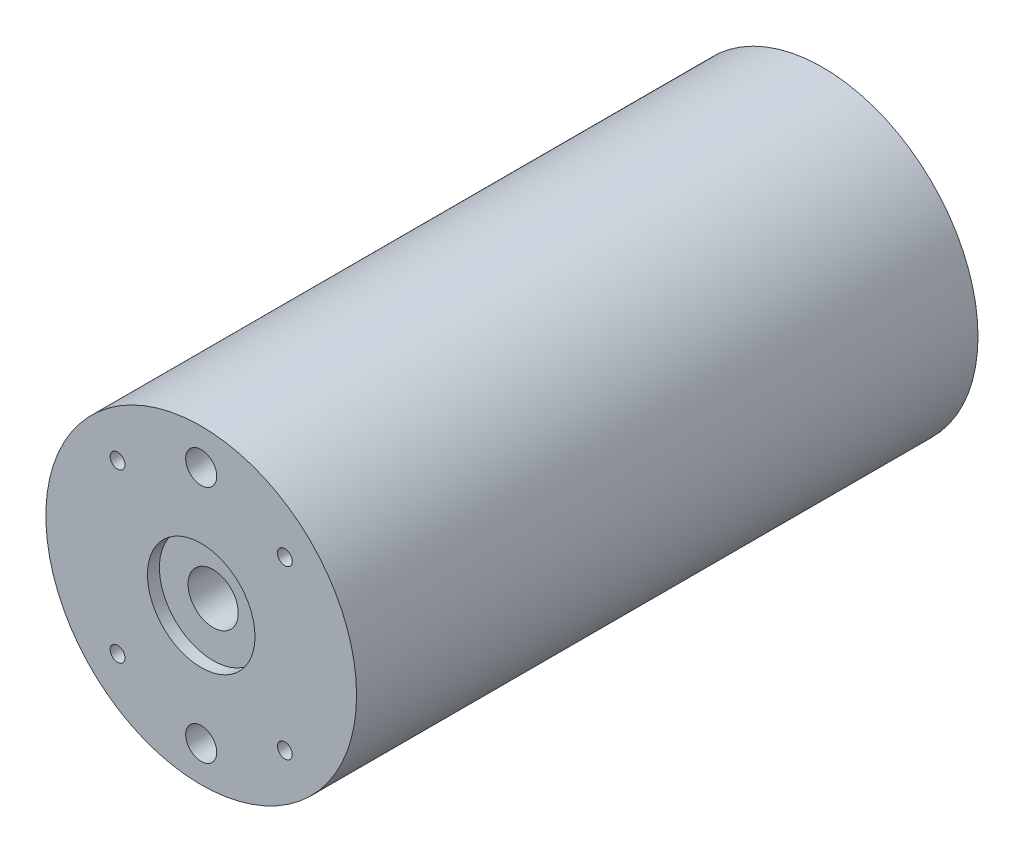
ISO-10303-21;
HEADER;
FILE_DESCRIPTION(('STEP AP214'),'2;1');
FILE_NAME('part.step','',(''),(''),'','','');
FILE_SCHEMA(('AUTOMOTIVE_DESIGN { 1 0 10303 214 1 1 1 1 }'));
ENDSEC;
DATA;
#1=APPLICATION_CONTEXT('core data for automotive mechanical design processes');
#2=APPLICATION_PROTOCOL_DEFINITION('international standard','automotive_design',2000,#1);
#3=PRODUCT_CONTEXT('',#1,'mechanical');
#4=PRODUCT('Part','Part','',(#3));
#5=PRODUCT_RELATED_PRODUCT_CATEGORY('part','',(#4));
#6=PRODUCT_DEFINITION_FORMATION('','',#4);
#7=PRODUCT_DEFINITION_CONTEXT('part definition',#1,'design');
#8=PRODUCT_DEFINITION('design','',#6,#7);
#9=PRODUCT_DEFINITION_SHAPE('','',#8);
#10=(LENGTH_UNIT() NAMED_UNIT(*) SI_UNIT(.MILLI.,.METRE.));
#11=(NAMED_UNIT(*) PLANE_ANGLE_UNIT() SI_UNIT($,.RADIAN.));
#12=(NAMED_UNIT(*) SI_UNIT($,.STERADIAN.) SOLID_ANGLE_UNIT());
#13=UNCERTAINTY_MEASURE_WITH_UNIT(LENGTH_MEASURE(1.E-05),#10,'distance_accuracy_value','');
#14=(GEOMETRIC_REPRESENTATION_CONTEXT(3) GLOBAL_UNCERTAINTY_ASSIGNED_CONTEXT((#13)) GLOBAL_UNIT_ASSIGNED_CONTEXT((#10,
#11,#12)) REPRESENTATION_CONTEXT('',''));
#15=CARTESIAN_POINT('',(0.,0.,0.));
#16=DIRECTION('',(0.,0.,1.));
#17=DIRECTION('',(1.,0.,0.));
#18=AXIS2_PLACEMENT_3D('',#15,#16,#17);
#19=CARTESIAN_POINT('',(0.,0.,165.1));
#20=DIRECTION('',(0.,0.,-1.));
#21=DIRECTION('',(-1.,0.,0.));
#22=AXIS2_PLACEMENT_3D('',#19,#20,#21);
#23=CYLINDRICAL_SURFACE('',#22,41.275);
#24=CARTESIAN_POINT('',(0.,0.,165.1));
#25=DIRECTION('',(0.,0.,1.));
#26=DIRECTION('',(1.,0.,0.));
#27=AXIS2_PLACEMENT_3D('',#24,#25,#26);
#28=CIRCLE('',#27,41.275);
#29=CARTESIAN_POINT('',(41.275,0.,165.1));
#30=VERTEX_POINT('',#29);
#31=EDGE_CURVE('E10',#30,#30,#28,.T.);
#32=ORIENTED_EDGE('',*,*,#31,.F.);
#33=EDGE_LOOP('',(#32));
#34=FACE_BOUND('',#33,.T.);
#35=CARTESIAN_POINT('',(0.,0.,0.));
#36=DIRECTION('',(0.,0.,1.));
#37=DIRECTION('',(1.,0.,0.));
#38=AXIS2_PLACEMENT_3D('',#35,#36,#37);
#39=CIRCLE('',#38,41.275);
#40=CARTESIAN_POINT('',(41.275,0.,0.));
#41=VERTEX_POINT('',#40);
#42=EDGE_CURVE('E35',#41,#41,#39,.T.);
#43=ORIENTED_EDGE('',*,*,#42,.T.);
#44=EDGE_LOOP('',(#43));
#45=FACE_BOUND('',#44,.T.);
#46=ADVANCED_FACE('F32',(#34,#45),#23,.T.);
#47=CARTESIAN_POINT('',(0.,0.,165.1));
#48=DIRECTION('',(0.,0.,1.));
#49=DIRECTION('',(1.,0.,0.));
#50=AXIS2_PLACEMENT_3D('',#47,#48,#49);
#51=PLANE('',#50);
#52=CARTESIAN_POINT('',(22.225,22.225,165.1));
#53=DIRECTION('',(0.,0.,1.));
#54=DIRECTION('',(1.,0.,0.));
#55=AXIS2_PLACEMENT_3D('',#52,#53,#54);
#56=CIRCLE('',#55,1.9685);
#57=CARTESIAN_POINT('',(24.1935,22.225,165.1));
#58=VERTEX_POINT('',#57);
#59=EDGE_CURVE('E86',#58,#58,#56,.T.);
#60=ORIENTED_EDGE('',*,*,#59,.F.);
#61=EDGE_LOOP('',(#60));
#62=FACE_BOUND('',#61,.T.);
#63=CARTESIAN_POINT('',(22.225,-22.225,165.1));
#64=DIRECTION('',(0.,0.,1.));
#65=DIRECTION('',(1.,0.,0.));
#66=AXIS2_PLACEMENT_3D('',#63,#64,#65);
#67=CIRCLE('',#66,1.9685);
#68=CARTESIAN_POINT('',(24.1935,-22.225,165.1));
#69=VERTEX_POINT('',#68);
#70=EDGE_CURVE('E80',#69,#69,#67,.T.);
#71=ORIENTED_EDGE('',*,*,#70,.F.);
#72=EDGE_LOOP('',(#71));
#73=FACE_BOUND('',#72,.T.);
#74=CARTESIAN_POINT('',(-22.225,-22.225,165.1));
#75=DIRECTION('',(0.,0.,1.));
#76=DIRECTION('',(1.,0.,0.));
#77=AXIS2_PLACEMENT_3D('',#74,#75,#76);
#78=CIRCLE('',#77,1.9685);
#79=CARTESIAN_POINT('',(-20.2565,-22.225,165.1));
#80=VERTEX_POINT('',#79);
#81=EDGE_CURVE('E74',#80,#80,#78,.T.);
#82=ORIENTED_EDGE('',*,*,#81,.F.);
#83=EDGE_LOOP('',(#82));
#84=FACE_BOUND('',#83,.T.);
#85=CARTESIAN_POINT('',(-22.225,22.225,165.1));
#86=DIRECTION('',(0.,0.,1.));
#87=DIRECTION('',(1.,0.,0.));
#88=AXIS2_PLACEMENT_3D('',#85,#86,#87);
#89=CIRCLE('',#88,1.9685);
#90=CARTESIAN_POINT('',(-20.2565,22.225,165.1));
#91=VERTEX_POINT('',#90);
#92=EDGE_CURVE('E68',#91,#91,#89,.T.);
#93=ORIENTED_EDGE('',*,*,#92,.F.);
#94=EDGE_LOOP('',(#93));
#95=FACE_BOUND('',#94,.T.);
#96=CARTESIAN_POINT('',(0.,-31.75,165.1));
#97=DIRECTION('',(0.,0.,1.));
#98=DIRECTION('',(1.,0.,0.));
#99=AXIS2_PLACEMENT_3D('',#96,#97,#98);
#100=CIRCLE('',#99,4.1275);
#101=CARTESIAN_POINT('',(4.1275,-31.75,165.1));
#102=VERTEX_POINT('',#101);
#103=EDGE_CURVE('E62',#102,#102,#100,.T.);
#104=ORIENTED_EDGE('',*,*,#103,.F.);
#105=EDGE_LOOP('',(#104));
#106=FACE_BOUND('',#105,.T.);
#107=CARTESIAN_POINT('',(0.,31.75,165.1));
#108=DIRECTION('',(0.,0.,1.));
#109=DIRECTION('',(1.,0.,0.));
#110=AXIS2_PLACEMENT_3D('',#107,#108,#109);
#111=CIRCLE('',#110,4.1275);
#112=CARTESIAN_POINT('',(4.1275,31.75,165.1));
#113=VERTEX_POINT('',#112);
#114=EDGE_CURVE('E56',#113,#113,#111,.T.);
#115=ORIENTED_EDGE('',*,*,#114,.F.);
#116=EDGE_LOOP('',(#115));
#117=FACE_BOUND('',#116,.T.);
#118=CARTESIAN_POINT('',(0.,0.,165.1));
#119=DIRECTION('',(0.,0.,1.));
#120=DIRECTION('',(1.,0.,0.));
#121=AXIS2_PLACEMENT_3D('',#118,#119,#120);
#122=CIRCLE('',#121,14.2875);
#123=CARTESIAN_POINT('',(14.2875,0.,165.1));
#124=VERTEX_POINT('',#123);
#125=EDGE_CURVE('E44',#124,#124,#122,.T.);
#126=ORIENTED_EDGE('',*,*,#125,.F.);
#127=EDGE_LOOP('',(#126));
#128=FACE_BOUND('',#127,.T.);
#129=ORIENTED_EDGE('',*,*,#31,.T.);
#130=EDGE_LOOP('',(#129));
#131=FACE_BOUND('',#130,.T.);
#132=ADVANCED_FACE('F111',(#62,#73,#84,#95,#106,#117,#128,#131),#51,.T.);
#133=CARTESIAN_POINT('',(0.,0.,0.));
#134=DIRECTION('',(0.,0.,1.));
#135=DIRECTION('',(1.,0.,0.));
#136=AXIS2_PLACEMENT_3D('',#133,#134,#135);
#137=PLANE('',#136);
#138=CARTESIAN_POINT('',(0.,0.,0.));
#139=DIRECTION('',(0.,0.,-1.));
#140=DIRECTION('',(-1.,0.,0.));
#141=AXIS2_PLACEMENT_3D('',#138,#139,#140);
#142=CIRCLE('',#141,14.2875);
#143=CARTESIAN_POINT('',(-14.2875,0.,0.));
#144=VERTEX_POINT('',#143);
#145=EDGE_CURVE('E92',#144,#144,#142,.T.);
#146=ORIENTED_EDGE('',*,*,#145,.F.);
#147=EDGE_LOOP('',(#146));
#148=FACE_BOUND('',#147,.T.);
#149=ORIENTED_EDGE('',*,*,#42,.F.);
#150=EDGE_LOOP('',(#149));
#151=FACE_BOUND('',#150,.T.);
#152=ADVANCED_FACE('F107',(#148,#151),#137,.F.);
#153=CARTESIAN_POINT('',(0.,0.,161.925));
#154=DIRECTION('',(0.,0.,1.));
#155=DIRECTION('',(1.,0.,0.));
#156=AXIS2_PLACEMENT_3D('',#153,#154,#155);
#157=CYLINDRICAL_SURFACE('',#156,14.2875);
#158=CARTESIAN_POINT('',(0.,0.,161.925));
#159=DIRECTION('',(0.,0.,1.));
#160=DIRECTION('',(1.,0.,0.));
#161=AXIS2_PLACEMENT_3D('',#158,#159,#160);
#162=CIRCLE('',#161,14.2875);
#163=CARTESIAN_POINT('',(14.2875,0.,161.925));
#164=VERTEX_POINT('',#163);
#165=EDGE_CURVE('E42',#164,#164,#162,.T.);
#166=ORIENTED_EDGE('',*,*,#165,.F.);
#167=EDGE_LOOP('',(#166));
#168=FACE_BOUND('',#167,.T.);
#169=ORIENTED_EDGE('',*,*,#125,.T.);
#170=EDGE_LOOP('',(#169));
#171=FACE_BOUND('',#170,.T.);
#172=ADVANCED_FACE('F110',(#168,#171),#157,.F.);
#173=CARTESIAN_POINT('',(0.,0.,161.925));
#174=DIRECTION('',(0.,0.,1.));
#175=DIRECTION('',(1.,0.,0.));
#176=AXIS2_PLACEMENT_3D('',#173,#174,#175);
#177=PLANE('',#176);
#178=CARTESIAN_POINT('',(0.,0.,161.925));
#179=DIRECTION('',(0.,0.,1.));
#180=DIRECTION('',(1.,0.,0.));
#181=AXIS2_PLACEMENT_3D('',#178,#179,#180);
#182=CIRCLE('',#181,6.6675);
#183=CARTESIAN_POINT('',(6.6675,0.,161.925));
#184=VERTEX_POINT('',#183);
#185=EDGE_CURVE('E50',#184,#184,#182,.T.);
#186=ORIENTED_EDGE('',*,*,#185,.F.);
#187=EDGE_LOOP('',(#186));
#188=FACE_BOUND('',#187,.T.);
#189=ORIENTED_EDGE('',*,*,#165,.T.);
#190=EDGE_LOOP('',(#189));
#191=FACE_BOUND('',#190,.T.);
#192=ADVANCED_FACE('F128',(#188,#191),#177,.T.);
#193=CARTESIAN_POINT('',(0.,0.,149.225));
#194=DIRECTION('',(0.,0.,1.));
#195=DIRECTION('',(1.,0.,0.));
#196=AXIS2_PLACEMENT_3D('',#193,#194,#195);
#197=CYLINDRICAL_SURFACE('',#196,6.6675);
#198=CARTESIAN_POINT('',(0.,0.,149.225));
#199=DIRECTION('',(0.,0.,1.));
#200=DIRECTION('',(1.,0.,0.));
#201=AXIS2_PLACEMENT_3D('',#198,#199,#200);
#202=CIRCLE('',#201,6.6675);
#203=CARTESIAN_POINT('',(6.6675,0.,149.225));
#204=VERTEX_POINT('',#203);
#205=EDGE_CURVE('E47',#204,#204,#202,.T.);
#206=ORIENTED_EDGE('',*,*,#205,.F.);
#207=EDGE_LOOP('',(#206));
#208=FACE_BOUND('',#207,.T.);
#209=ORIENTED_EDGE('',*,*,#185,.T.);
#210=EDGE_LOOP('',(#209));
#211=FACE_BOUND('',#210,.T.);
#212=ADVANCED_FACE('F132',(#208,#211),#197,.F.);
#213=CARTESIAN_POINT('',(0.,0.,149.225));
#214=DIRECTION('',(0.,0.,1.));
#215=DIRECTION('',(1.,0.,0.));
#216=AXIS2_PLACEMENT_3D('',#213,#214,#215);
#217=PLANE('',#216);
#218=ORIENTED_EDGE('',*,*,#205,.T.);
#219=EDGE_LOOP('',(#218));
#220=FACE_BOUND('',#219,.T.);
#221=ADVANCED_FACE('F136',(#220),#217,.T.);
#222=CARTESIAN_POINT('',(0.,31.75,155.575));
#223=DIRECTION('',(0.,0.,1.));
#224=DIRECTION('',(1.,0.,0.));
#225=AXIS2_PLACEMENT_3D('',#222,#223,#224);
#226=CYLINDRICAL_SURFACE('',#225,4.1275);
#227=CARTESIAN_POINT('',(0.,31.75,155.575));
#228=DIRECTION('',(0.,0.,1.));
#229=DIRECTION('',(1.,0.,0.));
#230=AXIS2_PLACEMENT_3D('',#227,#228,#229);
#231=CIRCLE('',#230,4.1275);
#232=CARTESIAN_POINT('',(4.1275,31.75,155.575));
#233=VERTEX_POINT('',#232);
#234=EDGE_CURVE('E53',#233,#233,#231,.T.);
#235=CARTESIAN_POINT('',(4.1275,31.75,155.575));
#236=CARTESIAN_POINT('',(4.1275,31.75,155.67421875));
#237=CARTESIAN_POINT('',(4.1275,31.75,155.7734375));
#238=CARTESIAN_POINT('',(4.1275,31.75,155.971875));
#239=CARTESIAN_POINT('',(4.1275,31.75,156.07109375));
#240=CARTESIAN_POINT('',(4.1275,31.75,156.26953125));
#241=CARTESIAN_POINT('',(4.1275,31.75,156.36875));
#242=CARTESIAN_POINT('',(4.1275,31.75,156.5671875));
#243=CARTESIAN_POINT('',(4.1275,31.75,156.66640625));
#244=CARTESIAN_POINT('',(4.1275,31.75,156.86484375));
#245=CARTESIAN_POINT('',(4.1275,31.75,156.9640625));
#246=CARTESIAN_POINT('',(4.1275,31.75,157.1625));
#247=CARTESIAN_POINT('',(4.1275,31.75,157.26171875));
#248=CARTESIAN_POINT('',(4.1275,31.75,157.46015625));
#249=CARTESIAN_POINT('',(4.1275,31.75,157.559375));
#250=CARTESIAN_POINT('',(4.1275,31.75,157.7578125));
#251=CARTESIAN_POINT('',(4.1275,31.75,157.85703125));
#252=CARTESIAN_POINT('',(4.1275,31.75,158.05546875));
#253=CARTESIAN_POINT('',(4.1275,31.75,158.1546875));
#254=CARTESIAN_POINT('',(4.1275,31.75,158.353125));
#255=CARTESIAN_POINT('',(4.1275,31.75,158.45234375));
#256=CARTESIAN_POINT('',(4.1275,31.75,158.65078125));
#257=CARTESIAN_POINT('',(4.1275,31.75,158.75));
#258=CARTESIAN_POINT('',(4.1275,31.75,158.9484375));
#259=CARTESIAN_POINT('',(4.1275,31.75,159.04765625));
#260=CARTESIAN_POINT('',(4.1275,31.75,159.24609375));
#261=CARTESIAN_POINT('',(4.1275,31.75,159.3453125));
#262=CARTESIAN_POINT('',(4.1275,31.75,159.54375));
#263=CARTESIAN_POINT('',(4.1275,31.75,159.64296875));
#264=CARTESIAN_POINT('',(4.1275,31.75,159.84140625));
#265=CARTESIAN_POINT('',(4.1275,31.75,159.940625));
#266=CARTESIAN_POINT('',(4.1275,31.75,160.1390625));
#267=CARTESIAN_POINT('',(4.1275,31.75,160.23828125));
#268=CARTESIAN_POINT('',(4.1275,31.75,160.43671875));
#269=CARTESIAN_POINT('',(4.1275,31.75,160.5359375));
#270=CARTESIAN_POINT('',(4.1275,31.75,160.734375));
#271=CARTESIAN_POINT('',(4.1275,31.75,160.83359375));
#272=CARTESIAN_POINT('',(4.1275,31.75,161.03203125));
#273=CARTESIAN_POINT('',(4.1275,31.75,161.13125));
#274=CARTESIAN_POINT('',(4.1275,31.75,161.3296875));
#275=CARTESIAN_POINT('',(4.1275,31.75,161.42890625));
#276=CARTESIAN_POINT('',(4.1275,31.75,161.62734375));
#277=CARTESIAN_POINT('',(4.1275,31.75,161.7265625));
#278=CARTESIAN_POINT('',(4.1275,31.75,161.925));
#279=CARTESIAN_POINT('',(4.1275,31.75,162.02421875));
#280=CARTESIAN_POINT('',(4.1275,31.75,162.22265625));
#281=CARTESIAN_POINT('',(4.1275,31.75,162.321875));
#282=CARTESIAN_POINT('',(4.1275,31.75,162.5203125));
#283=CARTESIAN_POINT('',(4.1275,31.75,162.61953125));
#284=CARTESIAN_POINT('',(4.1275,31.75,162.81796875));
#285=CARTESIAN_POINT('',(4.1275,31.75,162.9171875));
#286=CARTESIAN_POINT('',(4.1275,31.75,163.115625));
#287=CARTESIAN_POINT('',(4.1275,31.75,163.21484375));
#288=CARTESIAN_POINT('',(4.1275,31.75,163.41328125));
#289=CARTESIAN_POINT('',(4.1275,31.75,163.5125));
#290=CARTESIAN_POINT('',(4.1275,31.75,163.7109375));
#291=CARTESIAN_POINT('',(4.1275,31.75,163.81015625));
#292=CARTESIAN_POINT('',(4.1275,31.75,164.00859375));
#293=CARTESIAN_POINT('',(4.1275,31.75,164.1078125));
#294=CARTESIAN_POINT('',(4.1275,31.75,164.30625));
#295=CARTESIAN_POINT('',(4.1275,31.75,164.40546875));
#296=CARTESIAN_POINT('',(4.1275,31.75,164.60390625));
#297=CARTESIAN_POINT('',(4.1275,31.75,164.703125));
#298=CARTESIAN_POINT('',(4.1275,31.75,164.9015625));
#299=CARTESIAN_POINT('',(4.1275,31.75,165.00078125));
#300=CARTESIAN_POINT('',(4.1275,31.75,165.1));
#301=B_SPLINE_CURVE_WITH_KNOTS('',3,(#235,#236,#237,#238,#239,#240,#241,#242,#243,#244,#245,
#246,#247,#248,#249,#250,#251,#252,#253,#254,#255,#256,#257,#258,#259,#260,#261,#262,#263,#264,
#265,#266,#267,#268,#269,#270,#271,#272,#273,#274,#275,#276,#277,#278,#279,#280,#281,#282,#283,
#284,#285,#286,#287,#288,#289,#290,#291,#292,#293,#294,#295,#296,#297,#298,#299,#300),
.UNSPECIFIED.,.F.,.F.,(4,2,2,2,2,2,2,2,2,2,2,2,2,2,2,2,2,2,2,2,2,2,2,2,2,2,2,2,2,2,2,2,4),(0.,
0.297656250000028,0.595312500000028,0.892968750000028,1.19062500000003,1.48828125000003,
1.78593750000003,2.08359375000003,2.38125000000003,2.67890625000003,2.97656250000003,
3.27421875000003,3.57187500000003,3.86953125000003,4.16718750000003,4.46484375000003,
4.76250000000003,5.06015625000003,5.35781250000003,5.65546875000003,5.95312500000003,
6.25078125000003,6.54843750000003,6.84609375000003,7.14375000000003,7.44140625000003,
7.73906250000003,8.03671875000003,8.33437500000003,8.63203125000003,8.92968750000003,
9.22734375000003,9.52500000000003),.UNSPECIFIED.);
#302=EDGE_CURVE('BSEAM140',#233,#113,#301,.T.);
#303=ORIENTED_EDGE('',*,*,#234,.F.);
#304=ORIENTED_EDGE('',*,*,#114,.T.);
#305=ORIENTED_EDGE('',*,*,#302,.T.);
#306=ORIENTED_EDGE('',*,*,#302,.F.);
#307=EDGE_LOOP('',(#303,#305,#304,#306));
#308=FACE_BOUND('',#307,.T.);
#309=ADVANCED_FACE('F140',(#308),#226,.F.);
#310=CARTESIAN_POINT('',(0.,31.75,155.575));
#311=DIRECTION('',(0.,0.,1.));
#312=DIRECTION('',(1.,0.,0.));
#313=AXIS2_PLACEMENT_3D('',#310,#311,#312);
#314=PLANE('',#313);
#315=ORIENTED_EDGE('',*,*,#234,.T.);
#316=EDGE_LOOP('',(#315));
#317=FACE_BOUND('',#316,.T.);
#318=ADVANCED_FACE('F144',(#317),#314,.T.);
#319=CARTESIAN_POINT('',(0.,-31.75,155.575));
#320=DIRECTION('',(0.,0.,1.));
#321=DIRECTION('',(1.,0.,0.));
#322=AXIS2_PLACEMENT_3D('',#319,#320,#321);
#323=CYLINDRICAL_SURFACE('',#322,4.1275);
#324=CARTESIAN_POINT('',(0.,-31.75,155.575));
#325=DIRECTION('',(0.,0.,1.));
#326=DIRECTION('',(1.,0.,0.));
#327=AXIS2_PLACEMENT_3D('',#324,#325,#326);
#328=CIRCLE('',#327,4.1275);
#329=CARTESIAN_POINT('',(4.1275,-31.75,155.575));
#330=VERTEX_POINT('',#329);
#331=EDGE_CURVE('E59',#330,#330,#328,.T.);
#332=CARTESIAN_POINT('',(4.1275,-31.75,155.575));
#333=CARTESIAN_POINT('',(4.1275,-31.75,155.67421875));
#334=CARTESIAN_POINT('',(4.1275,-31.75,155.7734375));
#335=CARTESIAN_POINT('',(4.1275,-31.75,155.971875));
#336=CARTESIAN_POINT('',(4.1275,-31.75,156.07109375));
#337=CARTESIAN_POINT('',(4.1275,-31.75,156.26953125));
#338=CARTESIAN_POINT('',(4.1275,-31.75,156.36875));
#339=CARTESIAN_POINT('',(4.1275,-31.75,156.5671875));
#340=CARTESIAN_POINT('',(4.1275,-31.75,156.66640625));
#341=CARTESIAN_POINT('',(4.1275,-31.75,156.86484375));
#342=CARTESIAN_POINT('',(4.1275,-31.75,156.9640625));
#343=CARTESIAN_POINT('',(4.1275,-31.75,157.1625));
#344=CARTESIAN_POINT('',(4.1275,-31.75,157.26171875));
#345=CARTESIAN_POINT('',(4.1275,-31.75,157.46015625));
#346=CARTESIAN_POINT('',(4.1275,-31.75,157.559375));
#347=CARTESIAN_POINT('',(4.1275,-31.75,157.7578125));
#348=CARTESIAN_POINT('',(4.1275,-31.75,157.85703125));
#349=CARTESIAN_POINT('',(4.1275,-31.75,158.05546875));
#350=CARTESIAN_POINT('',(4.1275,-31.75,158.1546875));
#351=CARTESIAN_POINT('',(4.1275,-31.75,158.353125));
#352=CARTESIAN_POINT('',(4.1275,-31.75,158.45234375));
#353=CARTESIAN_POINT('',(4.1275,-31.75,158.65078125));
#354=CARTESIAN_POINT('',(4.1275,-31.75,158.75));
#355=CARTESIAN_POINT('',(4.1275,-31.75,158.9484375));
#356=CARTESIAN_POINT('',(4.1275,-31.75,159.04765625));
#357=CARTESIAN_POINT('',(4.1275,-31.75,159.24609375));
#358=CARTESIAN_POINT('',(4.1275,-31.75,159.3453125));
#359=CARTESIAN_POINT('',(4.1275,-31.75,159.54375));
#360=CARTESIAN_POINT('',(4.1275,-31.75,159.64296875));
#361=CARTESIAN_POINT('',(4.1275,-31.75,159.84140625));
#362=CARTESIAN_POINT('',(4.1275,-31.75,159.940625));
#363=CARTESIAN_POINT('',(4.1275,-31.75,160.1390625));
#364=CARTESIAN_POINT('',(4.1275,-31.75,160.23828125));
#365=CARTESIAN_POINT('',(4.1275,-31.75,160.43671875));
#366=CARTESIAN_POINT('',(4.1275,-31.75,160.5359375));
#367=CARTESIAN_POINT('',(4.1275,-31.75,160.734375));
#368=CARTESIAN_POINT('',(4.1275,-31.75,160.83359375));
#369=CARTESIAN_POINT('',(4.1275,-31.75,161.03203125));
#370=CARTESIAN_POINT('',(4.1275,-31.75,161.13125));
#371=CARTESIAN_POINT('',(4.1275,-31.75,161.3296875));
#372=CARTESIAN_POINT('',(4.1275,-31.75,161.42890625));
#373=CARTESIAN_POINT('',(4.1275,-31.75,161.62734375));
#374=CARTESIAN_POINT('',(4.1275,-31.75,161.7265625));
#375=CARTESIAN_POINT('',(4.1275,-31.75,161.925));
#376=CARTESIAN_POINT('',(4.1275,-31.75,162.02421875));
#377=CARTESIAN_POINT('',(4.1275,-31.75,162.22265625));
#378=CARTESIAN_POINT('',(4.1275,-31.75,162.321875));
#379=CARTESIAN_POINT('',(4.1275,-31.75,162.5203125));
#380=CARTESIAN_POINT('',(4.1275,-31.75,162.61953125));
#381=CARTESIAN_POINT('',(4.1275,-31.75,162.81796875));
#382=CARTESIAN_POINT('',(4.1275,-31.75,162.9171875));
#383=CARTESIAN_POINT('',(4.1275,-31.75,163.115625));
#384=CARTESIAN_POINT('',(4.1275,-31.75,163.21484375));
#385=CARTESIAN_POINT('',(4.1275,-31.75,163.41328125));
#386=CARTESIAN_POINT('',(4.1275,-31.75,163.5125));
#387=CARTESIAN_POINT('',(4.1275,-31.75,163.7109375));
#388=CARTESIAN_POINT('',(4.1275,-31.75,163.81015625));
#389=CARTESIAN_POINT('',(4.1275,-31.75,164.00859375));
#390=CARTESIAN_POINT('',(4.1275,-31.75,164.1078125));
#391=CARTESIAN_POINT('',(4.1275,-31.75,164.30625));
#392=CARTESIAN_POINT('',(4.1275,-31.75,164.40546875));
#393=CARTESIAN_POINT('',(4.1275,-31.75,164.60390625));
#394=CARTESIAN_POINT('',(4.1275,-31.75,164.703125));
#395=CARTESIAN_POINT('',(4.1275,-31.75,164.9015625));
#396=CARTESIAN_POINT('',(4.1275,-31.75,165.00078125));
#397=CARTESIAN_POINT('',(4.1275,-31.75,165.1));
#398=B_SPLINE_CURVE_WITH_KNOTS('',3,(#332,#333,#334,#335,#336,#337,#338,#339,#340,#341,#342,
#343,#344,#345,#346,#347,#348,#349,#350,#351,#352,#353,#354,#355,#356,#357,#358,#359,#360,#361,
#362,#363,#364,#365,#366,#367,#368,#369,#370,#371,#372,#373,#374,#375,#376,#377,#378,#379,#380,
#381,#382,#383,#384,#385,#386,#387,#388,#389,#390,#391,#392,#393,#394,#395,#396,#397),
.UNSPECIFIED.,.F.,.F.,(4,2,2,2,2,2,2,2,2,2,2,2,2,2,2,2,2,2,2,2,2,2,2,2,2,2,2,2,2,2,2,2,4),(0.,
0.297656250000028,0.595312500000028,0.892968750000028,1.19062500000003,1.48828125000003,
1.78593750000003,2.08359375000003,2.38125000000003,2.67890625000003,2.97656250000003,
3.27421875000003,3.57187500000003,3.86953125000003,4.16718750000003,4.46484375000003,
4.76250000000003,5.06015625000003,5.35781250000003,5.65546875000003,5.95312500000003,
6.25078125000003,6.54843750000003,6.84609375000003,7.14375000000003,7.44140625000003,
7.73906250000003,8.03671875000003,8.33437500000003,8.63203125000003,8.92968750000003,
9.22734375000003,9.52500000000003),.UNSPECIFIED.);
#399=EDGE_CURVE('BSEAM148',#330,#102,#398,.T.);
#400=ORIENTED_EDGE('',*,*,#331,.F.);
#401=ORIENTED_EDGE('',*,*,#103,.T.);
#402=ORIENTED_EDGE('',*,*,#399,.T.);
#403=ORIENTED_EDGE('',*,*,#399,.F.);
#404=EDGE_LOOP('',(#400,#402,#401,#403));
#405=FACE_BOUND('',#404,.T.);
#406=ADVANCED_FACE('F148',(#405),#323,.F.);
#407=CARTESIAN_POINT('',(0.,-31.75,155.575));
#408=DIRECTION('',(0.,0.,1.));
#409=DIRECTION('',(1.,0.,0.));
#410=AXIS2_PLACEMENT_3D('',#407,#408,#409);
#411=PLANE('',#410);
#412=ORIENTED_EDGE('',*,*,#331,.T.);
#413=EDGE_LOOP('',(#412));
#414=FACE_BOUND('',#413,.T.);
#415=ADVANCED_FACE('F152',(#414),#411,.T.);
#416=CARTESIAN_POINT('',(-22.225,22.225,146.05));
#417=DIRECTION('',(0.,0.,1.));
#418=DIRECTION('',(1.,0.,0.));
#419=AXIS2_PLACEMENT_3D('',#416,#417,#418);
#420=CYLINDRICAL_SURFACE('',#419,1.9685);
#421=CARTESIAN_POINT('',(-22.225,22.225,146.05));
#422=DIRECTION('',(0.,0.,1.));
#423=DIRECTION('',(1.,0.,0.));
#424=AXIS2_PLACEMENT_3D('',#421,#422,#423);
#425=CIRCLE('',#424,1.9685);
#426=CARTESIAN_POINT('',(-20.2565,22.225,146.05));
#427=VERTEX_POINT('',#426);
#428=EDGE_CURVE('E65',#427,#427,#425,.T.);
#429=CARTESIAN_POINT('',(-20.2565,22.225,146.05));
#430=CARTESIAN_POINT('',(-20.2565,22.225,146.2484375));
#431=CARTESIAN_POINT('',(-20.2565,22.225,146.446875));
#432=CARTESIAN_POINT('',(-20.2565,22.225,146.84375));
#433=CARTESIAN_POINT('',(-20.2565,22.225,147.0421875));
#434=CARTESIAN_POINT('',(-20.2565,22.225,147.4390625));
#435=CARTESIAN_POINT('',(-20.2565,22.225,147.6375));
#436=CARTESIAN_POINT('',(-20.2565,22.225,148.034375));
#437=CARTESIAN_POINT('',(-20.2565,22.225,148.2328125));
#438=CARTESIAN_POINT('',(-20.2565,22.225,148.6296875));
#439=CARTESIAN_POINT('',(-20.2565,22.225,148.828125));
#440=CARTESIAN_POINT('',(-20.2565,22.225,149.225));
#441=CARTESIAN_POINT('',(-20.2565,22.225,149.4234375));
#442=CARTESIAN_POINT('',(-20.2565,22.225,149.8203125));
#443=CARTESIAN_POINT('',(-20.2565,22.225,150.01875));
#444=CARTESIAN_POINT('',(-20.2565,22.225,150.415625));
#445=CARTESIAN_POINT('',(-20.2565,22.225,150.6140625));
#446=CARTESIAN_POINT('',(-20.2565,22.225,151.0109375));
#447=CARTESIAN_POINT('',(-20.2565,22.225,151.209375));
#448=CARTESIAN_POINT('',(-20.2565,22.225,151.60625));
#449=CARTESIAN_POINT('',(-20.2565,22.225,151.8046875));
#450=CARTESIAN_POINT('',(-20.2565,22.225,152.2015625));
#451=CARTESIAN_POINT('',(-20.2565,22.225,152.4));
#452=CARTESIAN_POINT('',(-20.2565,22.225,152.796875));
#453=CARTESIAN_POINT('',(-20.2565,22.225,152.9953125));
#454=CARTESIAN_POINT('',(-20.2565,22.225,153.3921875));
#455=CARTESIAN_POINT('',(-20.2565,22.225,153.590625));
#456=CARTESIAN_POINT('',(-20.2565,22.225,153.9875));
#457=CARTESIAN_POINT('',(-20.2565,22.225,154.1859375));
#458=CARTESIAN_POINT('',(-20.2565,22.225,154.5828125));
#459=CARTESIAN_POINT('',(-20.2565,22.225,154.78125));
#460=CARTESIAN_POINT('',(-20.2565,22.225,155.178125));
#461=CARTESIAN_POINT('',(-20.2565,22.225,155.3765625));
#462=CARTESIAN_POINT('',(-20.2565,22.225,155.7734375));
#463=CARTESIAN_POINT('',(-20.2565,22.225,155.971875));
#464=CARTESIAN_POINT('',(-20.2565,22.225,156.36875));
#465=CARTESIAN_POINT('',(-20.2565,22.225,156.5671875));
#466=CARTESIAN_POINT('',(-20.2565,22.225,156.9640625));
#467=CARTESIAN_POINT('',(-20.2565,22.225,157.1625));
#468=CARTESIAN_POINT('',(-20.2565,22.225,157.559375));
#469=CARTESIAN_POINT('',(-20.2565,22.225,157.7578125));
#470=CARTESIAN_POINT('',(-20.2565,22.225,158.1546875));
#471=CARTESIAN_POINT('',(-20.2565,22.225,158.353125));
#472=CARTESIAN_POINT('',(-20.2565,22.225,158.75));
#473=CARTESIAN_POINT('',(-20.2565,22.225,158.9484375));
#474=CARTESIAN_POINT('',(-20.2565,22.225,159.3453125));
#475=CARTESIAN_POINT('',(-20.2565,22.225,159.54375));
#476=CARTESIAN_POINT('',(-20.2565,22.225,159.940625));
#477=CARTESIAN_POINT('',(-20.2565,22.225,160.1390625));
#478=CARTESIAN_POINT('',(-20.2565,22.225,160.5359375));
#479=CARTESIAN_POINT('',(-20.2565,22.225,160.734375));
#480=CARTESIAN_POINT('',(-20.2565,22.225,161.13125));
#481=CARTESIAN_POINT('',(-20.2565,22.225,161.3296875));
#482=CARTESIAN_POINT('',(-20.2565,22.225,161.7265625));
#483=CARTESIAN_POINT('',(-20.2565,22.225,161.925));
#484=CARTESIAN_POINT('',(-20.2565,22.225,162.321875));
#485=CARTESIAN_POINT('',(-20.2565,22.225,162.5203125));
#486=CARTESIAN_POINT('',(-20.2565,22.225,162.9171875));
#487=CARTESIAN_POINT('',(-20.2565,22.225,163.115625));
#488=CARTESIAN_POINT('',(-20.2565,22.225,163.5125));
#489=CARTESIAN_POINT('',(-20.2565,22.225,163.7109375));
#490=CARTESIAN_POINT('',(-20.2565,22.225,164.1078125));
#491=CARTESIAN_POINT('',(-20.2565,22.225,164.30625));
#492=CARTESIAN_POINT('',(-20.2565,22.225,164.703125));
#493=CARTESIAN_POINT('',(-20.2565,22.225,164.9015625));
#494=CARTESIAN_POINT('',(-20.2565,22.225,165.1));
#495=B_SPLINE_CURVE_WITH_KNOTS('',3,(#429,#430,#431,#432,#433,#434,#435,#436,#437,#438,#439,
#440,#441,#442,#443,#444,#445,#446,#447,#448,#449,#450,#451,#452,#453,#454,#455,#456,#457,#458,
#459,#460,#461,#462,#463,#464,#465,#466,#467,#468,#469,#470,#471,#472,#473,#474,#475,#476,#477,
#478,#479,#480,#481,#482,#483,#484,#485,#486,#487,#488,#489,#490,#491,#492,#493,#494),
.UNSPECIFIED.,.F.,.F.,(4,2,2,2,2,2,2,2,2,2,2,2,2,2,2,2,2,2,2,2,2,2,2,2,2,2,2,2,2,2,2,2,4),(0.,
0.5953125,1.190625,1.7859375,2.38125,2.9765625,3.571875,4.1671875,4.7625,5.3578125,5.953125,
6.5484375,7.14375,7.7390625,8.334375,8.92968750000001,9.52500000000001,10.1203125,10.715625,
11.3109375,11.90625,12.5015625,13.096875,13.6921875,14.2875,14.8828125,15.478125,16.0734375,
16.66875,17.2640625,17.859375,18.4546875,19.05),.UNSPECIFIED.);
#496=EDGE_CURVE('BSEAM156',#427,#91,#495,.T.);
#497=ORIENTED_EDGE('',*,*,#428,.F.);
#498=ORIENTED_EDGE('',*,*,#92,.T.);
#499=ORIENTED_EDGE('',*,*,#496,.T.);
#500=ORIENTED_EDGE('',*,*,#496,.F.);
#501=EDGE_LOOP('',(#497,#499,#498,#500));
#502=FACE_BOUND('',#501,.T.);
#503=ADVANCED_FACE('F156',(#502),#420,.F.);
#504=CARTESIAN_POINT('',(-22.225,22.225,146.05));
#505=DIRECTION('',(0.,0.,1.));
#506=DIRECTION('',(1.,0.,0.));
#507=AXIS2_PLACEMENT_3D('',#504,#505,#506);
#508=PLANE('',#507);
#509=ORIENTED_EDGE('',*,*,#428,.T.);
#510=EDGE_LOOP('',(#509));
#511=FACE_BOUND('',#510,.T.);
#512=ADVANCED_FACE('F160',(#511),#508,.T.);
#513=CARTESIAN_POINT('',(-22.225,-22.225,146.05));
#514=DIRECTION('',(0.,0.,1.));
#515=DIRECTION('',(1.,0.,0.));
#516=AXIS2_PLACEMENT_3D('',#513,#514,#515);
#517=CYLINDRICAL_SURFACE('',#516,1.9685);
#518=CARTESIAN_POINT('',(-22.225,-22.225,146.05));
#519=DIRECTION('',(0.,0.,1.));
#520=DIRECTION('',(1.,0.,0.));
#521=AXIS2_PLACEMENT_3D('',#518,#519,#520);
#522=CIRCLE('',#521,1.9685);
#523=CARTESIAN_POINT('',(-20.2565,-22.225,146.05));
#524=VERTEX_POINT('',#523);
#525=EDGE_CURVE('E71',#524,#524,#522,.T.);
#526=CARTESIAN_POINT('',(-20.2565,-22.225,146.05));
#527=CARTESIAN_POINT('',(-20.2565,-22.225,146.2484375));
#528=CARTESIAN_POINT('',(-20.2565,-22.225,146.446875));
#529=CARTESIAN_POINT('',(-20.2565,-22.225,146.84375));
#530=CARTESIAN_POINT('',(-20.2565,-22.225,147.0421875));
#531=CARTESIAN_POINT('',(-20.2565,-22.225,147.4390625));
#532=CARTESIAN_POINT('',(-20.2565,-22.225,147.6375));
#533=CARTESIAN_POINT('',(-20.2565,-22.225,148.034375));
#534=CARTESIAN_POINT('',(-20.2565,-22.225,148.2328125));
#535=CARTESIAN_POINT('',(-20.2565,-22.225,148.6296875));
#536=CARTESIAN_POINT('',(-20.2565,-22.225,148.828125));
#537=CARTESIAN_POINT('',(-20.2565,-22.225,149.225));
#538=CARTESIAN_POINT('',(-20.2565,-22.225,149.4234375));
#539=CARTESIAN_POINT('',(-20.2565,-22.225,149.8203125));
#540=CARTESIAN_POINT('',(-20.2565,-22.225,150.01875));
#541=CARTESIAN_POINT('',(-20.2565,-22.225,150.415625));
#542=CARTESIAN_POINT('',(-20.2565,-22.225,150.6140625));
#543=CARTESIAN_POINT('',(-20.2565,-22.225,151.0109375));
#544=CARTESIAN_POINT('',(-20.2565,-22.225,151.209375));
#545=CARTESIAN_POINT('',(-20.2565,-22.225,151.60625));
#546=CARTESIAN_POINT('',(-20.2565,-22.225,151.8046875));
#547=CARTESIAN_POINT('',(-20.2565,-22.225,152.2015625));
#548=CARTESIAN_POINT('',(-20.2565,-22.225,152.4));
#549=CARTESIAN_POINT('',(-20.2565,-22.225,152.796875));
#550=CARTESIAN_POINT('',(-20.2565,-22.225,152.9953125));
#551=CARTESIAN_POINT('',(-20.2565,-22.225,153.3921875));
#552=CARTESIAN_POINT('',(-20.2565,-22.225,153.590625));
#553=CARTESIAN_POINT('',(-20.2565,-22.225,153.9875));
#554=CARTESIAN_POINT('',(-20.2565,-22.225,154.1859375));
#555=CARTESIAN_POINT('',(-20.2565,-22.225,154.5828125));
#556=CARTESIAN_POINT('',(-20.2565,-22.225,154.78125));
#557=CARTESIAN_POINT('',(-20.2565,-22.225,155.178125));
#558=CARTESIAN_POINT('',(-20.2565,-22.225,155.3765625));
#559=CARTESIAN_POINT('',(-20.2565,-22.225,155.7734375));
#560=CARTESIAN_POINT('',(-20.2565,-22.225,155.971875));
#561=CARTESIAN_POINT('',(-20.2565,-22.225,156.36875));
#562=CARTESIAN_POINT('',(-20.2565,-22.225,156.5671875));
#563=CARTESIAN_POINT('',(-20.2565,-22.225,156.9640625));
#564=CARTESIAN_POINT('',(-20.2565,-22.225,157.1625));
#565=CARTESIAN_POINT('',(-20.2565,-22.225,157.559375));
#566=CARTESIAN_POINT('',(-20.2565,-22.225,157.7578125));
#567=CARTESIAN_POINT('',(-20.2565,-22.225,158.1546875));
#568=CARTESIAN_POINT('',(-20.2565,-22.225,158.353125));
#569=CARTESIAN_POINT('',(-20.2565,-22.225,158.75));
#570=CARTESIAN_POINT('',(-20.2565,-22.225,158.9484375));
#571=CARTESIAN_POINT('',(-20.2565,-22.225,159.3453125));
#572=CARTESIAN_POINT('',(-20.2565,-22.225,159.54375));
#573=CARTESIAN_POINT('',(-20.2565,-22.225,159.940625));
#574=CARTESIAN_POINT('',(-20.2565,-22.225,160.1390625));
#575=CARTESIAN_POINT('',(-20.2565,-22.225,160.5359375));
#576=CARTESIAN_POINT('',(-20.2565,-22.225,160.734375));
#577=CARTESIAN_POINT('',(-20.2565,-22.225,161.13125));
#578=CARTESIAN_POINT('',(-20.2565,-22.225,161.3296875));
#579=CARTESIAN_POINT('',(-20.2565,-22.225,161.7265625));
#580=CARTESIAN_POINT('',(-20.2565,-22.225,161.925));
#581=CARTESIAN_POINT('',(-20.2565,-22.225,162.321875));
#582=CARTESIAN_POINT('',(-20.2565,-22.225,162.5203125));
#583=CARTESIAN_POINT('',(-20.2565,-22.225,162.9171875));
#584=CARTESIAN_POINT('',(-20.2565,-22.225,163.115625));
#585=CARTESIAN_POINT('',(-20.2565,-22.225,163.5125));
#586=CARTESIAN_POINT('',(-20.2565,-22.225,163.7109375));
#587=CARTESIAN_POINT('',(-20.2565,-22.225,164.1078125));
#588=CARTESIAN_POINT('',(-20.2565,-22.225,164.30625));
#589=CARTESIAN_POINT('',(-20.2565,-22.225,164.703125));
#590=CARTESIAN_POINT('',(-20.2565,-22.225,164.9015625));
#591=CARTESIAN_POINT('',(-20.2565,-22.225,165.1));
#592=B_SPLINE_CURVE_WITH_KNOTS('',3,(#526,#527,#528,#529,#530,#531,#532,#533,#534,#535,#536,
#537,#538,#539,#540,#541,#542,#543,#544,#545,#546,#547,#548,#549,#550,#551,#552,#553,#554,#555,
#556,#557,#558,#559,#560,#561,#562,#563,#564,#565,#566,#567,#568,#569,#570,#571,#572,#573,#574,
#575,#576,#577,#578,#579,#580,#581,#582,#583,#584,#585,#586,#587,#588,#589,#590,#591),
.UNSPECIFIED.,.F.,.F.,(4,2,2,2,2,2,2,2,2,2,2,2,2,2,2,2,2,2,2,2,2,2,2,2,2,2,2,2,2,2,2,2,4),(0.,
0.5953125,1.190625,1.7859375,2.38125,2.9765625,3.571875,4.1671875,4.7625,5.3578125,5.953125,
6.5484375,7.14375,7.7390625,8.334375,8.92968750000001,9.52500000000001,10.1203125,10.715625,
11.3109375,11.90625,12.5015625,13.096875,13.6921875,14.2875,14.8828125,15.478125,16.0734375,
16.66875,17.2640625,17.859375,18.4546875,19.05),.UNSPECIFIED.);
#593=EDGE_CURVE('BSEAM164',#524,#80,#592,.T.);
#594=ORIENTED_EDGE('',*,*,#525,.F.);
#595=ORIENTED_EDGE('',*,*,#81,.T.);
#596=ORIENTED_EDGE('',*,*,#593,.T.);
#597=ORIENTED_EDGE('',*,*,#593,.F.);
#598=EDGE_LOOP('',(#594,#596,#595,#597));
#599=FACE_BOUND('',#598,.T.);
#600=ADVANCED_FACE('F164',(#599),#517,.F.);
#601=CARTESIAN_POINT('',(-22.225,-22.225,146.05));
#602=DIRECTION('',(0.,0.,1.));
#603=DIRECTION('',(1.,0.,0.));
#604=AXIS2_PLACEMENT_3D('',#601,#602,#603);
#605=PLANE('',#604);
#606=ORIENTED_EDGE('',*,*,#525,.T.);
#607=EDGE_LOOP('',(#606));
#608=FACE_BOUND('',#607,.T.);
#609=ADVANCED_FACE('F168',(#608),#605,.T.);
#610=CARTESIAN_POINT('',(22.225,-22.225,146.05));
#611=DIRECTION('',(0.,0.,1.));
#612=DIRECTION('',(1.,0.,0.));
#613=AXIS2_PLACEMENT_3D('',#610,#611,#612);
#614=CYLINDRICAL_SURFACE('',#613,1.9685);
#615=CARTESIAN_POINT('',(22.225,-22.225,146.05));
#616=DIRECTION('',(0.,0.,1.));
#617=DIRECTION('',(1.,0.,0.));
#618=AXIS2_PLACEMENT_3D('',#615,#616,#617);
#619=CIRCLE('',#618,1.9685);
#620=CARTESIAN_POINT('',(24.1935,-22.225,146.05));
#621=VERTEX_POINT('',#620);
#622=EDGE_CURVE('E77',#621,#621,#619,.T.);
#623=CARTESIAN_POINT('',(24.1935,-22.225,146.05));
#624=CARTESIAN_POINT('',(24.1935,-22.225,146.2484375));
#625=CARTESIAN_POINT('',(24.1935,-22.225,146.446875));
#626=CARTESIAN_POINT('',(24.1935,-22.225,146.84375));
#627=CARTESIAN_POINT('',(24.1935,-22.225,147.0421875));
#628=CARTESIAN_POINT('',(24.1935,-22.225,147.4390625));
#629=CARTESIAN_POINT('',(24.1935,-22.225,147.6375));
#630=CARTESIAN_POINT('',(24.1935,-22.225,148.034375));
#631=CARTESIAN_POINT('',(24.1935,-22.225,148.2328125));
#632=CARTESIAN_POINT('',(24.1935,-22.225,148.6296875));
#633=CARTESIAN_POINT('',(24.1935,-22.225,148.828125));
#634=CARTESIAN_POINT('',(24.1935,-22.225,149.225));
#635=CARTESIAN_POINT('',(24.1935,-22.225,149.4234375));
#636=CARTESIAN_POINT('',(24.1935,-22.225,149.8203125));
#637=CARTESIAN_POINT('',(24.1935,-22.225,150.01875));
#638=CARTESIAN_POINT('',(24.1935,-22.225,150.415625));
#639=CARTESIAN_POINT('',(24.1935,-22.225,150.6140625));
#640=CARTESIAN_POINT('',(24.1935,-22.225,151.0109375));
#641=CARTESIAN_POINT('',(24.1935,-22.225,151.209375));
#642=CARTESIAN_POINT('',(24.1935,-22.225,151.60625));
#643=CARTESIAN_POINT('',(24.1935,-22.225,151.8046875));
#644=CARTESIAN_POINT('',(24.1935,-22.225,152.2015625));
#645=CARTESIAN_POINT('',(24.1935,-22.225,152.4));
#646=CARTESIAN_POINT('',(24.1935,-22.225,152.796875));
#647=CARTESIAN_POINT('',(24.1935,-22.225,152.9953125));
#648=CARTESIAN_POINT('',(24.1935,-22.225,153.3921875));
#649=CARTESIAN_POINT('',(24.1935,-22.225,153.590625));
#650=CARTESIAN_POINT('',(24.1935,-22.225,153.9875));
#651=CARTESIAN_POINT('',(24.1935,-22.225,154.1859375));
#652=CARTESIAN_POINT('',(24.1935,-22.225,154.5828125));
#653=CARTESIAN_POINT('',(24.1935,-22.225,154.78125));
#654=CARTESIAN_POINT('',(24.1935,-22.225,155.178125));
#655=CARTESIAN_POINT('',(24.1935,-22.225,155.3765625));
#656=CARTESIAN_POINT('',(24.1935,-22.225,155.7734375));
#657=CARTESIAN_POINT('',(24.1935,-22.225,155.971875));
#658=CARTESIAN_POINT('',(24.1935,-22.225,156.36875));
#659=CARTESIAN_POINT('',(24.1935,-22.225,156.5671875));
#660=CARTESIAN_POINT('',(24.1935,-22.225,156.9640625));
#661=CARTESIAN_POINT('',(24.1935,-22.225,157.1625));
#662=CARTESIAN_POINT('',(24.1935,-22.225,157.559375));
#663=CARTESIAN_POINT('',(24.1935,-22.225,157.7578125));
#664=CARTESIAN_POINT('',(24.1935,-22.225,158.1546875));
#665=CARTESIAN_POINT('',(24.1935,-22.225,158.353125));
#666=CARTESIAN_POINT('',(24.1935,-22.225,158.75));
#667=CARTESIAN_POINT('',(24.1935,-22.225,158.9484375));
#668=CARTESIAN_POINT('',(24.1935,-22.225,159.3453125));
#669=CARTESIAN_POINT('',(24.1935,-22.225,159.54375));
#670=CARTESIAN_POINT('',(24.1935,-22.225,159.940625));
#671=CARTESIAN_POINT('',(24.1935,-22.225,160.1390625));
#672=CARTESIAN_POINT('',(24.1935,-22.225,160.5359375));
#673=CARTESIAN_POINT('',(24.1935,-22.225,160.734375));
#674=CARTESIAN_POINT('',(24.1935,-22.225,161.13125));
#675=CARTESIAN_POINT('',(24.1935,-22.225,161.3296875));
#676=CARTESIAN_POINT('',(24.1935,-22.225,161.7265625));
#677=CARTESIAN_POINT('',(24.1935,-22.225,161.925));
#678=CARTESIAN_POINT('',(24.1935,-22.225,162.321875));
#679=CARTESIAN_POINT('',(24.1935,-22.225,162.5203125));
#680=CARTESIAN_POINT('',(24.1935,-22.225,162.9171875));
#681=CARTESIAN_POINT('',(24.1935,-22.225,163.115625));
#682=CARTESIAN_POINT('',(24.1935,-22.225,163.5125));
#683=CARTESIAN_POINT('',(24.1935,-22.225,163.7109375));
#684=CARTESIAN_POINT('',(24.1935,-22.225,164.1078125));
#685=CARTESIAN_POINT('',(24.1935,-22.225,164.30625));
#686=CARTESIAN_POINT('',(24.1935,-22.225,164.703125));
#687=CARTESIAN_POINT('',(24.1935,-22.225,164.9015625));
#688=CARTESIAN_POINT('',(24.1935,-22.225,165.1));
#689=B_SPLINE_CURVE_WITH_KNOTS('',3,(#623,#624,#625,#626,#627,#628,#629,#630,#631,#632,#633,
#634,#635,#636,#637,#638,#639,#640,#641,#642,#643,#644,#645,#646,#647,#648,#649,#650,#651,#652,
#653,#654,#655,#656,#657,#658,#659,#660,#661,#662,#663,#664,#665,#666,#667,#668,#669,#670,#671,
#672,#673,#674,#675,#676,#677,#678,#679,#680,#681,#682,#683,#684,#685,#686,#687,#688),
.UNSPECIFIED.,.F.,.F.,(4,2,2,2,2,2,2,2,2,2,2,2,2,2,2,2,2,2,2,2,2,2,2,2,2,2,2,2,2,2,2,2,4),(0.,
0.5953125,1.190625,1.7859375,2.38125,2.9765625,3.571875,4.1671875,4.7625,5.3578125,5.953125,
6.5484375,7.14375,7.7390625,8.334375,8.92968750000001,9.52500000000001,10.1203125,10.715625,
11.3109375,11.90625,12.5015625,13.096875,13.6921875,14.2875,14.8828125,15.478125,16.0734375,
16.66875,17.2640625,17.859375,18.4546875,19.05),.UNSPECIFIED.);
#690=EDGE_CURVE('BSEAM172',#621,#69,#689,.T.);
#691=ORIENTED_EDGE('',*,*,#622,.F.);
#692=ORIENTED_EDGE('',*,*,#70,.T.);
#693=ORIENTED_EDGE('',*,*,#690,.T.);
#694=ORIENTED_EDGE('',*,*,#690,.F.);
#695=EDGE_LOOP('',(#691,#693,#692,#694));
#696=FACE_BOUND('',#695,.T.);
#697=ADVANCED_FACE('F172',(#696),#614,.F.);
#698=CARTESIAN_POINT('',(22.225,-22.225,146.05));
#699=DIRECTION('',(0.,0.,1.));
#700=DIRECTION('',(1.,0.,0.));
#701=AXIS2_PLACEMENT_3D('',#698,#699,#700);
#702=PLANE('',#701);
#703=ORIENTED_EDGE('',*,*,#622,.T.);
#704=EDGE_LOOP('',(#703));
#705=FACE_BOUND('',#704,.T.);
#706=ADVANCED_FACE('F176',(#705),#702,.T.);
#707=CARTESIAN_POINT('',(22.225,22.225,146.05));
#708=DIRECTION('',(0.,0.,1.));
#709=DIRECTION('',(1.,0.,0.));
#710=AXIS2_PLACEMENT_3D('',#707,#708,#709);
#711=CYLINDRICAL_SURFACE('',#710,1.9685);
#712=CARTESIAN_POINT('',(22.225,22.225,146.05));
#713=DIRECTION('',(0.,0.,1.));
#714=DIRECTION('',(1.,0.,0.));
#715=AXIS2_PLACEMENT_3D('',#712,#713,#714);
#716=CIRCLE('',#715,1.9685);
#717=CARTESIAN_POINT('',(24.1935,22.225,146.05));
#718=VERTEX_POINT('',#717);
#719=EDGE_CURVE('E83',#718,#718,#716,.T.);
#720=CARTESIAN_POINT('',(24.1935,22.225,146.05));
#721=CARTESIAN_POINT('',(24.1935,22.225,146.2484375));
#722=CARTESIAN_POINT('',(24.1935,22.225,146.446875));
#723=CARTESIAN_POINT('',(24.1935,22.225,146.84375));
#724=CARTESIAN_POINT('',(24.1935,22.225,147.0421875));
#725=CARTESIAN_POINT('',(24.1935,22.225,147.4390625));
#726=CARTESIAN_POINT('',(24.1935,22.225,147.6375));
#727=CARTESIAN_POINT('',(24.1935,22.225,148.034375));
#728=CARTESIAN_POINT('',(24.1935,22.225,148.2328125));
#729=CARTESIAN_POINT('',(24.1935,22.225,148.6296875));
#730=CARTESIAN_POINT('',(24.1935,22.225,148.828125));
#731=CARTESIAN_POINT('',(24.1935,22.225,149.225));
#732=CARTESIAN_POINT('',(24.1935,22.225,149.4234375));
#733=CARTESIAN_POINT('',(24.1935,22.225,149.8203125));
#734=CARTESIAN_POINT('',(24.1935,22.225,150.01875));
#735=CARTESIAN_POINT('',(24.1935,22.225,150.415625));
#736=CARTESIAN_POINT('',(24.1935,22.225,150.6140625));
#737=CARTESIAN_POINT('',(24.1935,22.225,151.0109375));
#738=CARTESIAN_POINT('',(24.1935,22.225,151.209375));
#739=CARTESIAN_POINT('',(24.1935,22.225,151.60625));
#740=CARTESIAN_POINT('',(24.1935,22.225,151.8046875));
#741=CARTESIAN_POINT('',(24.1935,22.225,152.2015625));
#742=CARTESIAN_POINT('',(24.1935,22.225,152.4));
#743=CARTESIAN_POINT('',(24.1935,22.225,152.796875));
#744=CARTESIAN_POINT('',(24.1935,22.225,152.9953125));
#745=CARTESIAN_POINT('',(24.1935,22.225,153.3921875));
#746=CARTESIAN_POINT('',(24.1935,22.225,153.590625));
#747=CARTESIAN_POINT('',(24.1935,22.225,153.9875));
#748=CARTESIAN_POINT('',(24.1935,22.225,154.1859375));
#749=CARTESIAN_POINT('',(24.1935,22.225,154.5828125));
#750=CARTESIAN_POINT('',(24.1935,22.225,154.78125));
#751=CARTESIAN_POINT('',(24.1935,22.225,155.178125));
#752=CARTESIAN_POINT('',(24.1935,22.225,155.3765625));
#753=CARTESIAN_POINT('',(24.1935,22.225,155.7734375));
#754=CARTESIAN_POINT('',(24.1935,22.225,155.971875));
#755=CARTESIAN_POINT('',(24.1935,22.225,156.36875));
#756=CARTESIAN_POINT('',(24.1935,22.225,156.5671875));
#757=CARTESIAN_POINT('',(24.1935,22.225,156.9640625));
#758=CARTESIAN_POINT('',(24.1935,22.225,157.1625));
#759=CARTESIAN_POINT('',(24.1935,22.225,157.559375));
#760=CARTESIAN_POINT('',(24.1935,22.225,157.7578125));
#761=CARTESIAN_POINT('',(24.1935,22.225,158.1546875));
#762=CARTESIAN_POINT('',(24.1935,22.225,158.353125));
#763=CARTESIAN_POINT('',(24.1935,22.225,158.75));
#764=CARTESIAN_POINT('',(24.1935,22.225,158.9484375));
#765=CARTESIAN_POINT('',(24.1935,22.225,159.3453125));
#766=CARTESIAN_POINT('',(24.1935,22.225,159.54375));
#767=CARTESIAN_POINT('',(24.1935,22.225,159.940625));
#768=CARTESIAN_POINT('',(24.1935,22.225,160.1390625));
#769=CARTESIAN_POINT('',(24.1935,22.225,160.5359375));
#770=CARTESIAN_POINT('',(24.1935,22.225,160.734375));
#771=CARTESIAN_POINT('',(24.1935,22.225,161.13125));
#772=CARTESIAN_POINT('',(24.1935,22.225,161.3296875));
#773=CARTESIAN_POINT('',(24.1935,22.225,161.7265625));
#774=CARTESIAN_POINT('',(24.1935,22.225,161.925));
#775=CARTESIAN_POINT('',(24.1935,22.225,162.321875));
#776=CARTESIAN_POINT('',(24.1935,22.225,162.5203125));
#777=CARTESIAN_POINT('',(24.1935,22.225,162.9171875));
#778=CARTESIAN_POINT('',(24.1935,22.225,163.115625));
#779=CARTESIAN_POINT('',(24.1935,22.225,163.5125));
#780=CARTESIAN_POINT('',(24.1935,22.225,163.7109375));
#781=CARTESIAN_POINT('',(24.1935,22.225,164.1078125));
#782=CARTESIAN_POINT('',(24.1935,22.225,164.30625));
#783=CARTESIAN_POINT('',(24.1935,22.225,164.703125));
#784=CARTESIAN_POINT('',(24.1935,22.225,164.9015625));
#785=CARTESIAN_POINT('',(24.1935,22.225,165.1));
#786=B_SPLINE_CURVE_WITH_KNOTS('',3,(#720,#721,#722,#723,#724,#725,#726,#727,#728,#729,#730,
#731,#732,#733,#734,#735,#736,#737,#738,#739,#740,#741,#742,#743,#744,#745,#746,#747,#748,#749,
#750,#751,#752,#753,#754,#755,#756,#757,#758,#759,#760,#761,#762,#763,#764,#765,#766,#767,#768,
#769,#770,#771,#772,#773,#774,#775,#776,#777,#778,#779,#780,#781,#782,#783,#784,#785),
.UNSPECIFIED.,.F.,.F.,(4,2,2,2,2,2,2,2,2,2,2,2,2,2,2,2,2,2,2,2,2,2,2,2,2,2,2,2,2,2,2,2,4),(0.,
0.5953125,1.190625,1.7859375,2.38125,2.9765625,3.571875,4.1671875,4.7625,5.3578125,5.953125,
6.5484375,7.14375,7.7390625,8.334375,8.92968750000001,9.52500000000001,10.1203125,10.715625,
11.3109375,11.90625,12.5015625,13.096875,13.6921875,14.2875,14.8828125,15.478125,16.0734375,
16.66875,17.2640625,17.859375,18.4546875,19.05),.UNSPECIFIED.);
#787=EDGE_CURVE('BSEAM180',#718,#58,#786,.T.);
#788=ORIENTED_EDGE('',*,*,#719,.F.);
#789=ORIENTED_EDGE('',*,*,#59,.T.);
#790=ORIENTED_EDGE('',*,*,#787,.T.);
#791=ORIENTED_EDGE('',*,*,#787,.F.);
#792=EDGE_LOOP('',(#788,#790,#789,#791));
#793=FACE_BOUND('',#792,.T.);
#794=ADVANCED_FACE('F180',(#793),#711,.F.);
#795=CARTESIAN_POINT('',(22.225,22.225,146.05));
#796=DIRECTION('',(0.,0.,1.));
#797=DIRECTION('',(1.,0.,0.));
#798=AXIS2_PLACEMENT_3D('',#795,#796,#797);
#799=PLANE('',#798);
#800=ORIENTED_EDGE('',*,*,#719,.T.);
#801=EDGE_LOOP('',(#800));
#802=FACE_BOUND('',#801,.T.);
#803=ADVANCED_FACE('F103',(#802),#799,.T.);
#804=CARTESIAN_POINT('',(0.,0.,3.175));
#805=DIRECTION('',(0.,0.,-1.));
#806=DIRECTION('',(-1.,0.,0.));
#807=AXIS2_PLACEMENT_3D('',#804,#805,#806);
#808=CYLINDRICAL_SURFACE('',#807,14.2875);
#809=CARTESIAN_POINT('',(0.,0.,3.175));
#810=DIRECTION('',(0.,0.,-1.));
#811=DIRECTION('',(-1.,0.,0.));
#812=AXIS2_PLACEMENT_3D('',#809,#810,#811);
#813=CIRCLE('',#812,14.2875);
#814=CARTESIAN_POINT('',(-14.2875,0.,3.175));
#815=VERTEX_POINT('',#814);
#816=EDGE_CURVE('E89',#815,#815,#813,.T.);
#817=ORIENTED_EDGE('',*,*,#816,.F.);
#818=EDGE_LOOP('',(#817));
#819=FACE_BOUND('',#818,.T.);
#820=ORIENTED_EDGE('',*,*,#145,.T.);
#821=EDGE_LOOP('',(#820));
#822=FACE_BOUND('',#821,.T.);
#823=ADVANCED_FACE('F100',(#819,#822),#808,.F.);
#824=CARTESIAN_POINT('',(0.,0.,3.175));
#825=DIRECTION('',(0.,0.,-1.));
#826=DIRECTION('',(-1.,0.,0.));
#827=AXIS2_PLACEMENT_3D('',#824,#825,#826);
#828=PLANE('',#827);
#829=ORIENTED_EDGE('',*,*,#816,.T.);
#830=EDGE_LOOP('',(#829));
#831=FACE_BOUND('',#830,.T.);
#832=ADVANCED_FACE('F98',(#831),#828,.T.);
#833=CLOSED_SHELL('',(#46,#132,#152,#172,#192,#212,#221,#309,#318,#406,#415,#503,#512,#600,#609,
#697,#706,#794,#803,#823,#832));
#834=MANIFOLD_SOLID_BREP('B2',#833);
#835=ADVANCED_BREP_SHAPE_REPRESENTATION('',(#18,#834),#14);
#836=SHAPE_DEFINITION_REPRESENTATION(#9,#835);
ENDSEC;
END-ISO-10303-21;
